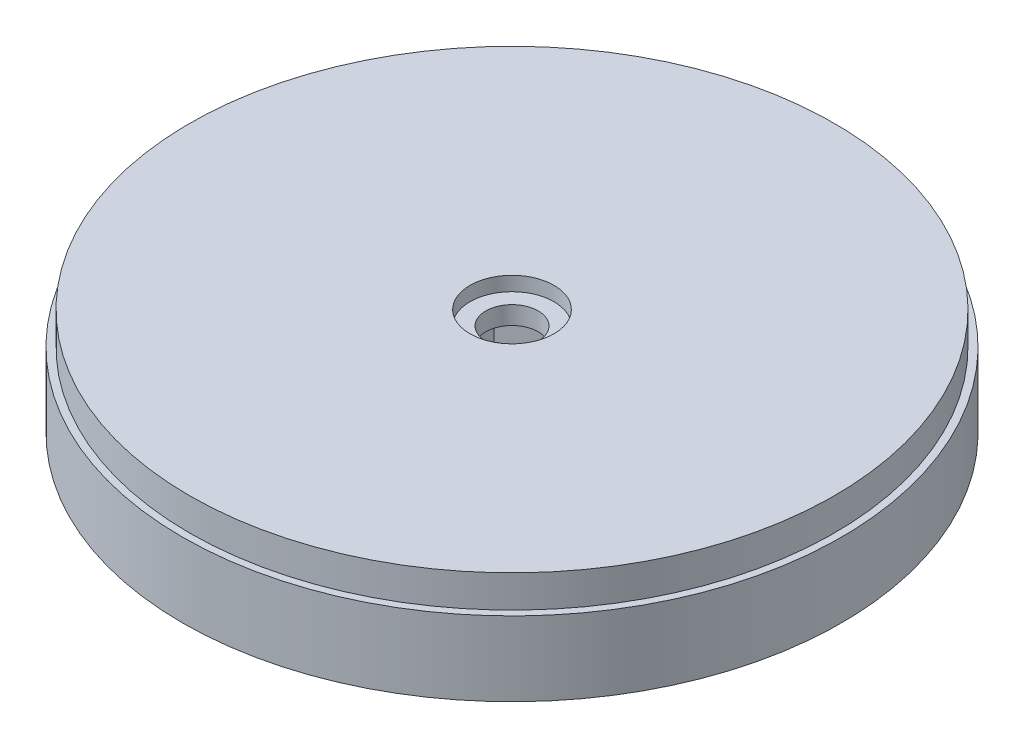
ISO-10303-21;
HEADER;
FILE_DESCRIPTION(('STEP AP214'),'2;1');
FILE_NAME('part.step','',(''),(''),'','','');
FILE_SCHEMA(('AUTOMOTIVE_DESIGN { 1 0 10303 214 1 1 1 1 }'));
ENDSEC;
DATA;
#1=APPLICATION_CONTEXT('core data for automotive mechanical design processes');
#2=APPLICATION_PROTOCOL_DEFINITION('international standard','automotive_design',2000,#1);
#3=PRODUCT_CONTEXT('',#1,'mechanical');
#4=PRODUCT('Part','Part','',(#3));
#5=PRODUCT_RELATED_PRODUCT_CATEGORY('part','',(#4));
#6=PRODUCT_DEFINITION_FORMATION('','',#4);
#7=PRODUCT_DEFINITION_CONTEXT('part definition',#1,'design');
#8=PRODUCT_DEFINITION('design','',#6,#7);
#9=PRODUCT_DEFINITION_SHAPE('','',#8);
#10=(LENGTH_UNIT() NAMED_UNIT(*) SI_UNIT(.MILLI.,.METRE.));
#11=(NAMED_UNIT(*) PLANE_ANGLE_UNIT() SI_UNIT($,.RADIAN.));
#12=(NAMED_UNIT(*) SI_UNIT($,.STERADIAN.) SOLID_ANGLE_UNIT());
#13=UNCERTAINTY_MEASURE_WITH_UNIT(LENGTH_MEASURE(1.E-05),#10,'distance_accuracy_value','');
#14=(GEOMETRIC_REPRESENTATION_CONTEXT(3) GLOBAL_UNCERTAINTY_ASSIGNED_CONTEXT((#13)) GLOBAL_UNIT_ASSIGNED_CONTEXT((#10,
#11,#12)) REPRESENTATION_CONTEXT('',''));
#15=CARTESIAN_POINT('',(0.,0.,0.));
#16=DIRECTION('',(0.,0.,1.));
#17=DIRECTION('',(1.,0.,0.));
#18=AXIS2_PLACEMENT_3D('',#15,#16,#17);
#19=CARTESIAN_POINT('',(0.,16.5,0.));
#20=DIRECTION('',(0.,-1.,0.));
#21=DIRECTION('',(0.,0.,-1.));
#22=AXIS2_PLACEMENT_3D('',#19,#20,#21);
#23=CYLINDRICAL_SURFACE('',#22,4.05);
#24=CARTESIAN_POINT('',(0.,11.5,0.));
#25=DIRECTION('',(0.,1.,0.));
#26=DIRECTION('',(0.,0.,1.));
#27=AXIS2_PLACEMENT_3D('',#24,#25,#26);
#28=CIRCLE('',#27,4.05);
#29=CARTESIAN_POINT('',(0.,11.5,4.05));
#30=VERTEX_POINT('',#29);
#31=EDGE_CURVE('E108',#30,#30,#28,.T.);
#32=ORIENTED_EDGE('',*,*,#31,.F.);
#33=EDGE_LOOP('',(#32));
#34=FACE_BOUND('',#33,.T.);
#35=CARTESIAN_POINT('',(0.,14.3,0.));
#36=DIRECTION('',(0.,1.,0.));
#37=DIRECTION('',(0.,0.,1.));
#38=AXIS2_PLACEMENT_3D('',#35,#36,#37);
#39=CIRCLE('',#38,4.05);
#40=CARTESIAN_POINT('',(0.,14.3,4.05));
#41=VERTEX_POINT('',#40);
#42=EDGE_CURVE('E43',#41,#41,#39,.T.);
#43=ORIENTED_EDGE('',*,*,#42,.T.);
#44=EDGE_LOOP('',(#43));
#45=FACE_BOUND('',#44,.T.);
#46=ADVANCED_FACE('F39',(#34,#45),#23,.F.);
#47=CARTESIAN_POINT('',(6.5,11.5,-3.75277674973257));
#48=DIRECTION('',(-0.5,0.,0.866025403784439));
#49=DIRECTION('',(0.866025403784439,0.,0.5));
#50=AXIS2_PLACEMENT_3D('',#47,#48,#49);
#51=PLANE('',#50);
#52=DIRECTION('',(0.,-1.,0.));
#53=VECTOR('',#52,1.);
#54=CARTESIAN_POINT('',(0.,11.5,-7.50555349946514));
#55=LINE('',#54,#53);
#56=CARTESIAN_POINT('',(0.,11.5,-7.50555349946514));
#57=VERTEX_POINT('',#56);
#58=CARTESIAN_POINT('',(0.,7.,-7.50555349946514));
#59=VERTEX_POINT('',#58);
#60=EDGE_CURVE('E106',#57,#59,#55,.T.);
#61=ORIENTED_EDGE('',*,*,#60,.T.);
#62=DIRECTION('',(0.866025403784439,0.,0.5));
#63=VECTOR('',#62,1.);
#64=CARTESIAN_POINT('',(6.5,7.,-3.75277674973257));
#65=LINE('',#64,#63);
#66=CARTESIAN_POINT('',(6.5,7.,-3.75277674973257));
#67=VERTEX_POINT('',#66);
#68=EDGE_CURVE('E93',#59,#67,#65,.T.);
#69=ORIENTED_EDGE('',*,*,#68,.T.);
#70=DIRECTION('',(0.,-1.,0.));
#71=VECTOR('',#70,1.);
#72=CARTESIAN_POINT('',(6.5,11.5,-3.75277674973257));
#73=LINE('',#72,#71);
#74=CARTESIAN_POINT('',(6.5,11.5,-3.75277674973257));
#75=VERTEX_POINT('',#74);
#76=EDGE_CURVE('E104',#75,#67,#73,.T.);
#77=ORIENTED_EDGE('',*,*,#76,.F.);
#78=DIRECTION('',(-0.866025403784439,0.,-0.5));
#79=VECTOR('',#78,1.);
#80=CARTESIAN_POINT('',(6.5,11.5,-3.75277674973257));
#81=LINE('',#80,#79);
#82=EDGE_CURVE('E227',#75,#57,#81,.T.);
#83=ORIENTED_EDGE('',*,*,#82,.T.);
#84=EDGE_LOOP('',(#61,#69,#77,#83));
#85=FACE_BOUND('',#84,.T.);
#86=ADVANCED_FACE('F102',(#85),#51,.T.);
#87=CARTESIAN_POINT('',(0.,11.5,-7.50555349946514));
#88=DIRECTION('',(0.5,0.,0.866025403784439));
#89=DIRECTION('',(0.866025403784439,0.,-0.5));
#90=AXIS2_PLACEMENT_3D('',#87,#88,#89);
#91=PLANE('',#90);
#92=DIRECTION('',(0.,-1.,0.));
#93=VECTOR('',#92,1.);
#94=CARTESIAN_POINT('',(-6.5,11.5,-3.75277674973257));
#95=LINE('',#94,#93);
#96=CARTESIAN_POINT('',(-6.5,11.5,-3.75277674973257));
#97=VERTEX_POINT('',#96);
#98=CARTESIAN_POINT('',(-6.5,7.,-3.75277674973257));
#99=VERTEX_POINT('',#98);
#100=EDGE_CURVE('E132',#97,#99,#95,.T.);
#101=ORIENTED_EDGE('',*,*,#100,.T.);
#102=DIRECTION('',(0.866025403784439,0.,-0.5));
#103=VECTOR('',#102,1.);
#104=CARTESIAN_POINT('',(0.,7.,-7.50555349946514));
#105=LINE('',#104,#103);
#106=EDGE_CURVE('E109',#99,#59,#105,.T.);
#107=ORIENTED_EDGE('',*,*,#106,.T.);
#108=ORIENTED_EDGE('',*,*,#60,.F.);
#109=DIRECTION('',(-0.866025403784439,0.,0.5));
#110=VECTOR('',#109,1.);
#111=CARTESIAN_POINT('',(0.,11.5,-7.50555349946514));
#112=LINE('',#111,#110);
#113=EDGE_CURVE('E205',#57,#97,#112,.T.);
#114=ORIENTED_EDGE('',*,*,#113,.T.);
#115=EDGE_LOOP('',(#101,#107,#108,#114));
#116=FACE_BOUND('',#115,.T.);
#117=ADVANCED_FACE('F167',(#116),#91,.T.);
#118=CARTESIAN_POINT('',(-6.5,11.5,-3.75277674973257));
#119=DIRECTION('',(1.,0.,0.));
#120=DIRECTION('',(0.,0.,-1.));
#121=AXIS2_PLACEMENT_3D('',#118,#119,#120);
#122=PLANE('',#121);
#123=DIRECTION('',(0.,-1.,0.));
#124=VECTOR('',#123,1.);
#125=CARTESIAN_POINT('',(-6.5,11.5,3.75277674973257));
#126=LINE('',#125,#124);
#127=CARTESIAN_POINT('',(-6.5,11.5,3.75277674973257));
#128=VERTEX_POINT('',#127);
#129=CARTESIAN_POINT('',(-6.5,7.,3.75277674973257));
#130=VERTEX_POINT('',#129);
#131=EDGE_CURVE('E128',#128,#130,#126,.T.);
#132=ORIENTED_EDGE('',*,*,#131,.T.);
#133=DIRECTION('',(0.,0.,-1.));
#134=VECTOR('',#133,1.);
#135=CARTESIAN_POINT('',(-6.5,7.,-3.75277674973257));
#136=LINE('',#135,#134);
#137=EDGE_CURVE('E209',#130,#99,#136,.T.);
#138=ORIENTED_EDGE('',*,*,#137,.T.);
#139=ORIENTED_EDGE('',*,*,#100,.F.);
#140=DIRECTION('',(0.,0.,1.));
#141=VECTOR('',#140,1.);
#142=CARTESIAN_POINT('',(-6.5,11.5,-3.75277674973257));
#143=LINE('',#142,#141);
#144=EDGE_CURVE('E207',#97,#128,#143,.T.);
#145=ORIENTED_EDGE('',*,*,#144,.T.);
#146=EDGE_LOOP('',(#132,#138,#139,#145));
#147=FACE_BOUND('',#146,.T.);
#148=ADVANCED_FACE('F194',(#147),#122,.T.);
#149=CARTESIAN_POINT('',(-6.5,11.5,3.75277674973257));
#150=DIRECTION('',(0.5,0.,-0.866025403784439));
#151=DIRECTION('',(-0.866025403784439,0.,-0.5));
#152=AXIS2_PLACEMENT_3D('',#149,#150,#151);
#153=PLANE('',#152);
#154=DIRECTION('',(0.,-1.,0.));
#155=VECTOR('',#154,1.);
#156=CARTESIAN_POINT('',(0.,11.5,7.50555349946514));
#157=LINE('',#156,#155);
#158=CARTESIAN_POINT('',(0.,11.5,7.50555349946514));
#159=VERTEX_POINT('',#158);
#160=CARTESIAN_POINT('',(0.,7.,7.50555349946514));
#161=VERTEX_POINT('',#160);
#162=EDGE_CURVE('E119',#159,#161,#157,.T.);
#163=ORIENTED_EDGE('',*,*,#162,.T.);
#164=DIRECTION('',(-0.866025403784439,0.,-0.5));
#165=VECTOR('',#164,1.);
#166=CARTESIAN_POINT('',(-6.5,7.,3.75277674973257));
#167=LINE('',#166,#165);
#168=EDGE_CURVE('E212',#161,#130,#167,.T.);
#169=ORIENTED_EDGE('',*,*,#168,.T.);
#170=ORIENTED_EDGE('',*,*,#131,.F.);
#171=DIRECTION('',(0.866025403784439,0.,0.5));
#172=VECTOR('',#171,1.);
#173=CARTESIAN_POINT('',(-6.5,11.5,3.75277674973257));
#174=LINE('',#173,#172);
#175=EDGE_CURVE('E63',#128,#159,#174,.T.);
#176=ORIENTED_EDGE('',*,*,#175,.T.);
#177=EDGE_LOOP('',(#163,#169,#170,#176));
#178=FACE_BOUND('',#177,.T.);
#179=ADVANCED_FACE('F190',(#178),#153,.T.);
#180=CARTESIAN_POINT('',(0.,11.5,7.50555349946514));
#181=DIRECTION('',(-0.5,0.,-0.866025403784439));
#182=DIRECTION('',(-0.866025403784439,0.,0.5));
#183=AXIS2_PLACEMENT_3D('',#180,#181,#182);
#184=PLANE('',#183);
#185=DIRECTION('',(0.,-1.,0.));
#186=VECTOR('',#185,1.);
#187=CARTESIAN_POINT('',(6.5,11.5,3.75277674973257));
#188=LINE('',#187,#186);
#189=CARTESIAN_POINT('',(6.5,11.5,3.75277674973257));
#190=VERTEX_POINT('',#189);
#191=CARTESIAN_POINT('',(6.5,7.,3.75277674973257));
#192=VERTEX_POINT('',#191);
#193=EDGE_CURVE('E115',#190,#192,#188,.T.);
#194=ORIENTED_EDGE('',*,*,#193,.T.);
#195=DIRECTION('',(-0.866025403784439,0.,0.5));
#196=VECTOR('',#195,1.);
#197=CARTESIAN_POINT('',(0.,7.,7.50555349946514));
#198=LINE('',#197,#196);
#199=EDGE_CURVE('E56',#192,#161,#198,.T.);
#200=ORIENTED_EDGE('',*,*,#199,.T.);
#201=ORIENTED_EDGE('',*,*,#162,.F.);
#202=DIRECTION('',(0.866025403784439,0.,-0.5));
#203=VECTOR('',#202,1.);
#204=CARTESIAN_POINT('',(0.,11.5,7.50555349946514));
#205=LINE('',#204,#203);
#206=EDGE_CURVE('E121',#159,#190,#205,.T.);
#207=ORIENTED_EDGE('',*,*,#206,.T.);
#208=EDGE_LOOP('',(#194,#200,#201,#207));
#209=FACE_BOUND('',#208,.T.);
#210=ADVANCED_FACE('F187',(#209),#184,.T.);
#211=CARTESIAN_POINT('',(6.5,11.5,3.75277674973257));
#212=DIRECTION('',(-1.,0.,0.));
#213=DIRECTION('',(0.,0.,1.));
#214=AXIS2_PLACEMENT_3D('',#211,#212,#213);
#215=PLANE('',#214);
#216=ORIENTED_EDGE('',*,*,#76,.T.);
#217=DIRECTION('',(0.,0.,1.));
#218=VECTOR('',#217,1.);
#219=CARTESIAN_POINT('',(6.5,7.,3.75277674973257));
#220=LINE('',#219,#218);
#221=EDGE_CURVE('E11',#67,#192,#220,.T.);
#222=ORIENTED_EDGE('',*,*,#221,.T.);
#223=ORIENTED_EDGE('',*,*,#193,.F.);
#224=DIRECTION('',(0.,0.,-1.));
#225=VECTOR('',#224,1.);
#226=CARTESIAN_POINT('',(6.5,11.5,3.75277674973257));
#227=LINE('',#226,#225);
#228=EDGE_CURVE('E113',#190,#75,#227,.T.);
#229=ORIENTED_EDGE('',*,*,#228,.T.);
#230=EDGE_LOOP('',(#216,#222,#223,#229));
#231=FACE_BOUND('',#230,.T.);
#232=ADVANCED_FACE('F112',(#231),#215,.T.);
#233=CARTESIAN_POINT('',(0.,11.5,0.));
#234=DIRECTION('',(0.,1.,0.));
#235=DIRECTION('',(0.,0.,1.));
#236=AXIS2_PLACEMENT_3D('',#233,#234,#235);
#237=PLANE('',#236);
#238=CARTESIAN_POINT('',(0.,11.5,0.));
#239=DIRECTION('',(0.,1.,0.));
#240=DIRECTION('',(0.,0.,1.));
#241=AXIS2_PLACEMENT_3D('',#238,#239,#240);
#242=CIRCLE('',#241,49.9);
#243=CARTESIAN_POINT('',(0.,11.5,49.9));
#244=VERTEX_POINT('',#243);
#245=EDGE_CURVE('E49',#244,#244,#242,.T.);
#246=ORIENTED_EDGE('',*,*,#245,.F.);
#247=EDGE_LOOP('',(#246));
#248=FACE_BOUND('',#247,.T.);
#249=CARTESIAN_POINT('',(0.,11.5,0.));
#250=DIRECTION('',(0.,1.,0.));
#251=DIRECTION('',(0.,0.,1.));
#252=AXIS2_PLACEMENT_3D('',#249,#250,#251);
#253=CIRCLE('',#252,51.);
#254=CARTESIAN_POINT('',(0.,11.5,51.));
#255=VERTEX_POINT('',#254);
#256=EDGE_CURVE('E139',#255,#255,#253,.T.);
#257=ORIENTED_EDGE('',*,*,#256,.T.);
#258=EDGE_LOOP('',(#257));
#259=FACE_BOUND('',#258,.T.);
#260=ADVANCED_FACE('F150',(#248,#259),#237,.T.);
#261=CARTESIAN_POINT('',(0.,0.,0.));
#262=DIRECTION('',(0.,1.,0.));
#263=DIRECTION('',(0.,0.,1.));
#264=AXIS2_PLACEMENT_3D('',#261,#262,#263);
#265=PLANE('',#264);
#266=CARTESIAN_POINT('',(0.,0.,0.));
#267=DIRECTION('',(0.,-1.,0.));
#268=DIRECTION('',(0.,0.,-1.));
#269=AXIS2_PLACEMENT_3D('',#266,#267,#268);
#270=CIRCLE('',#269,8.);
#271=CARTESIAN_POINT('',(0.,0.,-8.));
#272=VERTEX_POINT('',#271);
#273=EDGE_CURVE('E246',#272,#272,#270,.T.);
#274=ORIENTED_EDGE('',*,*,#273,.F.);
#275=EDGE_LOOP('',(#274));
#276=FACE_BOUND('',#275,.T.);
#277=CARTESIAN_POINT('',(0.,0.,0.));
#278=DIRECTION('',(0.,1.,0.));
#279=DIRECTION('',(0.,0.,1.));
#280=AXIS2_PLACEMENT_3D('',#277,#278,#279);
#281=CIRCLE('',#280,51.);
#282=CARTESIAN_POINT('',(0.,0.,51.));
#283=VERTEX_POINT('',#282);
#284=EDGE_CURVE('E138',#283,#283,#281,.T.);
#285=ORIENTED_EDGE('',*,*,#284,.F.);
#286=EDGE_LOOP('',(#285));
#287=FACE_BOUND('',#286,.T.);
#288=ADVANCED_FACE('F148',(#276,#287),#265,.F.);
#289=CARTESIAN_POINT('',(0.,11.5,0.));
#290=DIRECTION('',(0.,-1.,0.));
#291=DIRECTION('',(0.,0.,-1.));
#292=AXIS2_PLACEMENT_3D('',#289,#290,#291);
#293=CYLINDRICAL_SURFACE('',#292,51.);
#294=ORIENTED_EDGE('',*,*,#256,.F.);
#295=EDGE_LOOP('',(#294));
#296=FACE_BOUND('',#295,.T.);
#297=ORIENTED_EDGE('',*,*,#284,.T.);
#298=EDGE_LOOP('',(#297));
#299=FACE_BOUND('',#298,.T.);
#300=ADVANCED_FACE('F41',(#296,#299),#293,.T.);
#301=CARTESIAN_POINT('',(0.,16.5,0.));
#302=DIRECTION('',(0.,1.,0.));
#303=DIRECTION('',(0.,0.,1.));
#304=AXIS2_PLACEMENT_3D('',#301,#302,#303);
#305=PLANE('',#304);
#306=CARTESIAN_POINT('',(0.,16.5,0.));
#307=DIRECTION('',(0.,1.,0.));
#308=DIRECTION('',(0.,0.,1.));
#309=AXIS2_PLACEMENT_3D('',#306,#307,#308);
#310=CIRCLE('',#309,6.5);
#311=CARTESIAN_POINT('',(0.,16.5,6.5));
#312=VERTEX_POINT('',#311);
#313=EDGE_CURVE('E252',#312,#312,#310,.T.);
#314=ORIENTED_EDGE('',*,*,#313,.F.);
#315=EDGE_LOOP('',(#314));
#316=FACE_BOUND('',#315,.T.);
#317=CARTESIAN_POINT('',(0.,16.5,0.));
#318=DIRECTION('',(0.,1.,0.));
#319=DIRECTION('',(0.,0.,1.));
#320=AXIS2_PLACEMENT_3D('',#317,#318,#319);
#321=CIRCLE('',#320,49.9);
#322=CARTESIAN_POINT('',(0.,16.5,49.9));
#323=VERTEX_POINT('',#322);
#324=EDGE_CURVE('E223',#323,#323,#321,.T.);
#325=ORIENTED_EDGE('',*,*,#324,.T.);
#326=EDGE_LOOP('',(#325));
#327=FACE_BOUND('',#326,.T.);
#328=ADVANCED_FACE('F156',(#316,#327),#305,.T.);
#329=CARTESIAN_POINT('',(0.,11.5,0.));
#330=DIRECTION('',(0.,1.,0.));
#331=DIRECTION('',(0.,0.,1.));
#332=AXIS2_PLACEMENT_3D('',#329,#330,#331);
#333=PLANE('',#332);
#334=ORIENTED_EDGE('',*,*,#113,.F.);
#335=ORIENTED_EDGE('',*,*,#82,.F.);
#336=ORIENTED_EDGE('',*,*,#228,.F.);
#337=ORIENTED_EDGE('',*,*,#206,.F.);
#338=ORIENTED_EDGE('',*,*,#175,.F.);
#339=ORIENTED_EDGE('',*,*,#144,.F.);
#340=EDGE_LOOP('',(#334,#335,#336,#337,#338,#339));
#341=FACE_BOUND('',#340,.T.);
#342=ORIENTED_EDGE('',*,*,#31,.T.);
#343=EDGE_LOOP('',(#342));
#344=FACE_BOUND('',#343,.T.);
#345=ADVANCED_FACE('F177',(#341,#344),#333,.F.);
#346=CARTESIAN_POINT('',(0.,16.5,0.));
#347=DIRECTION('',(0.,-1.,0.));
#348=DIRECTION('',(0.,0.,-1.));
#349=AXIS2_PLACEMENT_3D('',#346,#347,#348);
#350=CYLINDRICAL_SURFACE('',#349,49.9);
#351=ORIENTED_EDGE('',*,*,#324,.F.);
#352=EDGE_LOOP('',(#351));
#353=FACE_BOUND('',#352,.T.);
#354=ORIENTED_EDGE('',*,*,#245,.T.);
#355=EDGE_LOOP('',(#354));
#356=FACE_BOUND('',#355,.T.);
#357=ADVANCED_FACE('F181',(#353,#356),#350,.T.);
#358=CARTESIAN_POINT('',(0.,7.,0.));
#359=DIRECTION('',(0.,-1.,0.));
#360=DIRECTION('',(0.,0.,-1.));
#361=AXIS2_PLACEMENT_3D('',#358,#359,#360);
#362=CYLINDRICAL_SURFACE('',#361,8.);
#363=CARTESIAN_POINT('',(0.,7.,0.));
#364=DIRECTION('',(0.,-1.,0.));
#365=DIRECTION('',(0.,0.,-1.));
#366=AXIS2_PLACEMENT_3D('',#363,#364,#365);
#367=CIRCLE('',#366,8.);
#368=CARTESIAN_POINT('',(0.,7.,-8.));
#369=VERTEX_POINT('',#368);
#370=EDGE_CURVE('E243',#369,#369,#367,.T.);
#371=ORIENTED_EDGE('',*,*,#370,.F.);
#372=EDGE_LOOP('',(#371));
#373=FACE_BOUND('',#372,.T.);
#374=ORIENTED_EDGE('',*,*,#273,.T.);
#375=EDGE_LOOP('',(#374));
#376=FACE_BOUND('',#375,.T.);
#377=ADVANCED_FACE('F173',(#373,#376),#362,.F.);
#378=CARTESIAN_POINT('',(0.,7.,0.));
#379=DIRECTION('',(0.,-1.,0.));
#380=DIRECTION('',(0.,0.,-1.));
#381=AXIS2_PLACEMENT_3D('',#378,#379,#380);
#382=PLANE('',#381);
#383=ORIENTED_EDGE('',*,*,#106,.F.);
#384=ORIENTED_EDGE('',*,*,#137,.F.);
#385=ORIENTED_EDGE('',*,*,#168,.F.);
#386=ORIENTED_EDGE('',*,*,#199,.F.);
#387=ORIENTED_EDGE('',*,*,#221,.F.);
#388=ORIENTED_EDGE('',*,*,#68,.F.);
#389=EDGE_LOOP('',(#383,#384,#385,#386,#387,#388));
#390=FACE_BOUND('',#389,.T.);
#391=ORIENTED_EDGE('',*,*,#370,.T.);
#392=EDGE_LOOP('',(#391));
#393=FACE_BOUND('',#392,.T.);
#394=ADVANCED_FACE('F91',(#390,#393),#382,.T.);
#395=CARTESIAN_POINT('',(0.,14.3,0.));
#396=DIRECTION('',(0.,1.,0.));
#397=DIRECTION('',(0.,0.,1.));
#398=AXIS2_PLACEMENT_3D('',#395,#396,#397);
#399=CYLINDRICAL_SURFACE('',#398,6.5);
#400=CARTESIAN_POINT('',(0.,14.3,0.));
#401=DIRECTION('',(0.,1.,0.));
#402=DIRECTION('',(0.,0.,1.));
#403=AXIS2_PLACEMENT_3D('',#400,#401,#402);
#404=CIRCLE('',#403,6.5);
#405=CARTESIAN_POINT('',(0.,14.3,6.5));
#406=VERTEX_POINT('',#405);
#407=EDGE_CURVE('E256',#406,#406,#404,.T.);
#408=ORIENTED_EDGE('',*,*,#407,.F.);
#409=EDGE_LOOP('',(#408));
#410=FACE_BOUND('',#409,.T.);
#411=ORIENTED_EDGE('',*,*,#313,.T.);
#412=EDGE_LOOP('',(#411));
#413=FACE_BOUND('',#412,.T.);
#414=ADVANCED_FACE('F267',(#410,#413),#399,.F.);
#415=CARTESIAN_POINT('',(0.,14.3,0.));
#416=DIRECTION('',(0.,1.,0.));
#417=DIRECTION('',(0.,0.,1.));
#418=AXIS2_PLACEMENT_3D('',#415,#416,#417);
#419=PLANE('',#418);
#420=ORIENTED_EDGE('',*,*,#42,.F.);
#421=EDGE_LOOP('',(#420));
#422=FACE_BOUND('',#421,.T.);
#423=ORIENTED_EDGE('',*,*,#407,.T.);
#424=EDGE_LOOP('',(#423));
#425=FACE_BOUND('',#424,.T.);
#426=ADVANCED_FACE('F265',(#422,#425),#419,.T.);
#427=CLOSED_SHELL('',(#46,#86,#117,#148,#179,#210,#232,#260,#288,#300,#328,#345,#357,#377,#394,
#414,#426));
#428=MANIFOLD_SOLID_BREP('B2',#427);
#429=ADVANCED_BREP_SHAPE_REPRESENTATION('',(#18,#428),#14);
#430=SHAPE_DEFINITION_REPRESENTATION(#9,#429);
ENDSEC;
END-ISO-10303-21;
